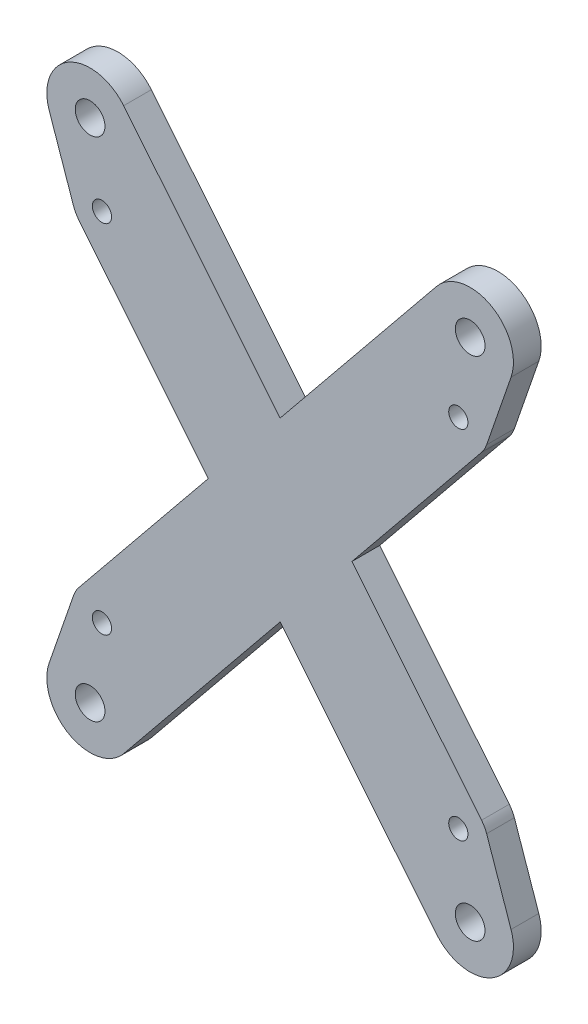
ISO-10303-21;
HEADER;
FILE_DESCRIPTION(('STEP AP214'),'2;1');
FILE_NAME('part.step','',(''),(''),'','','');
FILE_SCHEMA(('AUTOMOTIVE_DESIGN { 1 0 10303 214 1 1 1 1 }'));
ENDSEC;
DATA;
#1=APPLICATION_CONTEXT('core data for automotive mechanical design processes');
#2=APPLICATION_PROTOCOL_DEFINITION('international standard','automotive_design',2000,#1);
#3=PRODUCT_CONTEXT('',#1,'mechanical');
#4=PRODUCT('Part','Part','',(#3));
#5=PRODUCT_RELATED_PRODUCT_CATEGORY('part','',(#4));
#6=PRODUCT_DEFINITION_FORMATION('','',#4);
#7=PRODUCT_DEFINITION_CONTEXT('part definition',#1,'design');
#8=PRODUCT_DEFINITION('design','',#6,#7);
#9=PRODUCT_DEFINITION_SHAPE('','',#8);
#10=(LENGTH_UNIT() NAMED_UNIT(*) SI_UNIT(.MILLI.,.METRE.));
#11=(NAMED_UNIT(*) PLANE_ANGLE_UNIT() SI_UNIT($,.RADIAN.));
#12=(NAMED_UNIT(*) SI_UNIT($,.STERADIAN.) SOLID_ANGLE_UNIT());
#13=UNCERTAINTY_MEASURE_WITH_UNIT(LENGTH_MEASURE(1.E-05),#10,'distance_accuracy_value','');
#14=(GEOMETRIC_REPRESENTATION_CONTEXT(3) GLOBAL_UNCERTAINTY_ASSIGNED_CONTEXT((#13)) GLOBAL_UNIT_ASSIGNED_CONTEXT((#10,
#11,#12)) REPRESENTATION_CONTEXT('',''));
#15=CARTESIAN_POINT('',(0.,0.,0.));
#16=DIRECTION('',(0.,0.,1.));
#17=DIRECTION('',(1.,0.,0.));
#18=AXIS2_PLACEMENT_3D('',#15,#16,#17);
#19=CARTESIAN_POINT('',(-20.40001,20.40001,3.175));
#20=DIRECTION('',(0.,0.,1.));
#21=DIRECTION('',(1.,0.,0.));
#22=AXIS2_PLACEMENT_3D('',#19,#20,#21);
#23=PLANE('',#22);
#24=CARTESIAN_POINT('',(-20.40001,-20.40001,3.175));
#25=DIRECTION('',(0.,0.,1.));
#26=DIRECTION('',(1.,0.,0.));
#27=AXIS2_PLACEMENT_3D('',#24,#25,#26);
#28=CIRCLE('',#27,1.1);
#29=CARTESIAN_POINT('',(-19.30001,-20.40001,3.175));
#30=VERTEX_POINT('',#29);
#31=EDGE_CURVE('E411',#30,#30,#28,.T.);
#32=ORIENTED_EDGE('',*,*,#31,.F.);
#33=EDGE_LOOP('',(#32));
#34=FACE_BOUND('',#33,.T.);
#35=CARTESIAN_POINT('',(20.40001,20.40001,3.175));
#36=DIRECTION('',(0.,0.,1.));
#37=DIRECTION('',(1.,0.,0.));
#38=AXIS2_PLACEMENT_3D('',#35,#36,#37);
#39=CIRCLE('',#38,1.1);
#40=CARTESIAN_POINT('',(21.50001,20.40001,3.175));
#41=VERTEX_POINT('',#40);
#42=EDGE_CURVE('E423',#41,#41,#39,.T.);
#43=ORIENTED_EDGE('',*,*,#42,.F.);
#44=EDGE_LOOP('',(#43));
#45=FACE_BOUND('',#44,.T.);
#46=CARTESIAN_POINT('',(-21.7551,-28.9941,3.175));
#47=DIRECTION('',(0.,0.,1.));
#48=DIRECTION('',(1.,0.,0.));
#49=AXIS2_PLACEMENT_3D('',#46,#47,#48);
#50=CIRCLE('',#49,1.7018);
#51=CARTESIAN_POINT('',(-20.0533,-28.9941,3.175));
#52=VERTEX_POINT('',#51);
#53=EDGE_CURVE('E435',#52,#52,#50,.T.);
#54=ORIENTED_EDGE('',*,*,#53,.F.);
#55=EDGE_LOOP('',(#54));
#56=FACE_BOUND('',#55,.T.);
#57=CARTESIAN_POINT('',(21.7551,28.9941,3.175));
#58=DIRECTION('',(0.,0.,1.));
#59=DIRECTION('',(1.,0.,0.));
#60=AXIS2_PLACEMENT_3D('',#57,#58,#59);
#61=CIRCLE('',#60,1.7018);
#62=CARTESIAN_POINT('',(23.4569,28.9941,3.175));
#63=VERTEX_POINT('',#62);
#64=EDGE_CURVE('E206',#63,#63,#61,.T.);
#65=ORIENTED_EDGE('',*,*,#64,.F.);
#66=EDGE_LOOP('',(#65));
#67=FACE_BOUND('',#66,.T.);
#68=DIRECTION('',(-0.631137739312024,-0.775670776822298,0.));
#69=VECTOR('',#68,1.);
#70=CARTESIAN_POINT('',(-23.0597850937237,-18.2358386918991,3.175));
#71=LINE('',#70,#69);
#72=CARTESIAN_POINT('',(-8.22188433689183,0.,3.175));
#73=VERTEX_POINT('',#72);
#74=CARTESIAN_POINT('',(-23.0597850937237,-18.2358386918991,3.175));
#75=VERTEX_POINT('',#74);
#76=EDGE_CURVE('E241',#73,#75,#71,.T.);
#77=ORIENTED_EDGE('',*,*,#76,.T.);
#78=CARTESIAN_POINT('',(-20.40001,-20.40001,3.175));
#79=DIRECTION('',(0.,0.,1.));
#80=DIRECTION('',(1.,0.,0.));
#81=AXIS2_PLACEMENT_3D('',#78,#79,#80);
#82=CIRCLE('',#81,3.429);
#83=CARTESIAN_POINT('',(-23.6412405850369,-19.2808740410471,3.175));
#84=VERTEX_POINT('',#83);
#85=EDGE_CURVE('E129',#75,#84,#82,.T.);
#86=ORIENTED_EDGE('',*,*,#85,.T.);
#87=DIRECTION('',(-0.326373857962355,-0.945240765540065,0.));
#88=VECTOR('',#87,1.);
#89=CARTESIAN_POINT('',(-26.4368775117199,-27.3775702815125,3.175));
#90=LINE('',#89,#88);
#91=CARTESIAN_POINT('',(-26.4368775117199,-27.3775702815125,3.175));
#92=VERTEX_POINT('',#91);
#93=EDGE_CURVE('E292',#84,#92,#90,.T.);
#94=ORIENTED_EDGE('',*,*,#93,.T.);
#95=CARTESIAN_POINT('',(-21.7551,-28.9941,3.175));
#96=DIRECTION('',(0.,0.,1.));
#97=DIRECTION('',(1.,0.,0.));
#98=AXIS2_PLACEMENT_3D('',#95,#96,#97);
#99=CIRCLE('',#98,4.953);
#100=CARTESIAN_POINT('',(-17.9132026423992,-32.1201252228124,3.175));
#101=VERTEX_POINT('',#100);
#102=EDGE_CURVE('E311',#92,#101,#99,.T.);
#103=ORIENTED_EDGE('',*,*,#102,.T.);
#104=DIRECTION('',(0.631137739312024,0.775670776822299,0.));
#105=VECTOR('',#104,1.);
#106=CARTESIAN_POINT('',(-17.9132026423992,-32.1201252228124,3.175));
#107=LINE('',#106,#105);
#108=CARTESIAN_POINT('',(0.,-10.1047283553219,3.175));
#109=VERTEX_POINT('',#108);
#110=EDGE_CURVE('E308',#101,#109,#107,.T.);
#111=ORIENTED_EDGE('',*,*,#110,.T.);
#112=DIRECTION('',(0.631137739312024,-0.775670776822299,0.));
#113=VECTOR('',#112,1.);
#114=CARTESIAN_POINT('',(17.9132026423992,-32.1201252228124,3.175));
#115=LINE('',#114,#113);
#116=CARTESIAN_POINT('',(17.9132026423992,-32.1201252228124,3.175));
#117=VERTEX_POINT('',#116);
#118=EDGE_CURVE('E310',#109,#117,#115,.T.);
#119=ORIENTED_EDGE('',*,*,#118,.T.);
#120=CARTESIAN_POINT('',(21.7551,-28.9941,3.175));
#121=DIRECTION('',(0.,0.,1.));
#122=DIRECTION('',(1.,0.,0.));
#123=AXIS2_PLACEMENT_3D('',#120,#121,#122);
#124=CIRCLE('',#123,4.953);
#125=CARTESIAN_POINT('',(26.4368775117199,-27.3775702815125,3.175));
#126=VERTEX_POINT('',#125);
#127=EDGE_CURVE('E313',#117,#126,#124,.T.);
#128=ORIENTED_EDGE('',*,*,#127,.T.);
#129=DIRECTION('',(-0.326373857962355,0.945240765540065,0.));
#130=VECTOR('',#129,1.);
#131=CARTESIAN_POINT('',(26.4368775117199,-27.3775702815125,3.175));
#132=LINE('',#131,#130);
#133=CARTESIAN_POINT('',(23.6412405850369,-19.2808740410471,3.175));
#134=VERTEX_POINT('',#133);
#135=EDGE_CURVE('E319',#126,#134,#132,.T.);
#136=ORIENTED_EDGE('',*,*,#135,.T.);
#137=CARTESIAN_POINT('',(20.40001,-20.40001,3.175));
#138=DIRECTION('',(0.,0.,1.));
#139=DIRECTION('',(1.,0.,0.));
#140=AXIS2_PLACEMENT_3D('',#137,#138,#139);
#141=CIRCLE('',#140,3.42899999999999);
#142=CARTESIAN_POINT('',(23.0597850937237,-18.2358386918991,3.175));
#143=VERTEX_POINT('',#142);
#144=EDGE_CURVE('E321',#134,#143,#141,.T.);
#145=ORIENTED_EDGE('',*,*,#144,.T.);
#146=DIRECTION('',(-0.631137739312024,0.775670776822298,0.));
#147=VECTOR('',#146,1.);
#148=CARTESIAN_POINT('',(23.0597850937237,-18.2358386918991,3.175));
#149=LINE('',#148,#147);
#150=CARTESIAN_POINT('',(8.22188433689183,0.,3.175));
#151=VERTEX_POINT('',#150);
#152=EDGE_CURVE('E323',#143,#151,#149,.T.);
#153=ORIENTED_EDGE('',*,*,#152,.T.);
#154=DIRECTION('',(0.631137739312024,0.775670776822298,0.));
#155=VECTOR('',#154,1.);
#156=CARTESIAN_POINT('',(23.0597850937237,18.2358386918991,3.175));
#157=LINE('',#156,#155);
#158=CARTESIAN_POINT('',(23.0597850937237,18.2358386918991,3.175));
#159=VERTEX_POINT('',#158);
#160=EDGE_CURVE('E325',#151,#159,#157,.T.);
#161=ORIENTED_EDGE('',*,*,#160,.T.);
#162=CARTESIAN_POINT('',(20.40001,20.40001,3.175));
#163=DIRECTION('',(0.,0.,1.));
#164=DIRECTION('',(1.,0.,0.));
#165=AXIS2_PLACEMENT_3D('',#162,#163,#164);
#166=CIRCLE('',#165,3.42900000000001);
#167=CARTESIAN_POINT('',(23.6412405850369,19.2808740410471,3.175));
#168=VERTEX_POINT('',#167);
#169=EDGE_CURVE('E327',#159,#168,#166,.T.);
#170=ORIENTED_EDGE('',*,*,#169,.T.);
#171=DIRECTION('',(0.326373857962354,0.945240765540066,0.));
#172=VECTOR('',#171,1.);
#173=CARTESIAN_POINT('',(26.4368775117199,27.3775702815125,3.175));
#174=LINE('',#173,#172);
#175=CARTESIAN_POINT('',(26.4368775117199,27.3775702815125,3.175));
#176=VERTEX_POINT('',#175);
#177=EDGE_CURVE('E329',#168,#176,#174,.T.);
#178=ORIENTED_EDGE('',*,*,#177,.T.);
#179=CARTESIAN_POINT('',(21.7551,28.9941,3.175));
#180=DIRECTION('',(0.,0.,1.));
#181=DIRECTION('',(1.,0.,0.));
#182=AXIS2_PLACEMENT_3D('',#179,#180,#181);
#183=CIRCLE('',#182,4.953);
#184=CARTESIAN_POINT('',(17.9132026423992,32.1201252228124,3.175));
#185=VERTEX_POINT('',#184);
#186=EDGE_CURVE('E331',#176,#185,#183,.T.);
#187=ORIENTED_EDGE('',*,*,#186,.T.);
#188=DIRECTION('',(-0.631137739312024,-0.775670776822299,0.));
#189=VECTOR('',#188,1.);
#190=CARTESIAN_POINT('',(17.9132026423992,32.1201252228124,3.175));
#191=LINE('',#190,#189);
#192=CARTESIAN_POINT('',(0.,10.1047283553219,3.175));
#193=VERTEX_POINT('',#192);
#194=EDGE_CURVE('E333',#185,#193,#191,.T.);
#195=ORIENTED_EDGE('',*,*,#194,.T.);
#196=DIRECTION('',(-0.631137739312024,0.775670776822299,0.));
#197=VECTOR('',#196,1.);
#198=CARTESIAN_POINT('',(-17.9132026423992,32.1201252228124,3.175));
#199=LINE('',#198,#197);
#200=CARTESIAN_POINT('',(-17.9132026423992,32.1201252228124,3.175));
#201=VERTEX_POINT('',#200);
#202=EDGE_CURVE('E335',#193,#201,#199,.T.);
#203=ORIENTED_EDGE('',*,*,#202,.T.);
#204=CARTESIAN_POINT('',(-21.7551,28.9941,3.175));
#205=DIRECTION('',(0.,0.,1.));
#206=DIRECTION('',(1.,0.,0.));
#207=AXIS2_PLACEMENT_3D('',#204,#205,#206);
#208=CIRCLE('',#207,4.95299999999999);
#209=CARTESIAN_POINT('',(-26.4368775117199,27.3775702815125,3.175));
#210=VERTEX_POINT('',#209);
#211=EDGE_CURVE('E184',#201,#210,#208,.T.);
#212=ORIENTED_EDGE('',*,*,#211,.T.);
#213=DIRECTION('',(0.326373857962355,-0.945240765540065,0.));
#214=VECTOR('',#213,1.);
#215=CARTESIAN_POINT('',(-26.4368775117199,27.3775702815125,3.175));
#216=LINE('',#215,#214);
#217=CARTESIAN_POINT('',(-23.6412405850369,19.2808740410471,3.175));
#218=VERTEX_POINT('',#217);
#219=EDGE_CURVE('E178',#210,#218,#216,.T.);
#220=ORIENTED_EDGE('',*,*,#219,.T.);
#221=CARTESIAN_POINT('',(-20.40001,20.40001,3.175));
#222=DIRECTION('',(0.,0.,1.));
#223=DIRECTION('',(1.,0.,0.));
#224=AXIS2_PLACEMENT_3D('',#221,#222,#223);
#225=CIRCLE('',#224,3.42900000000001);
#226=CARTESIAN_POINT('',(-23.0597850937237,18.2358386918991,3.175));
#227=VERTEX_POINT('',#226);
#228=EDGE_CURVE('E182',#218,#227,#225,.T.);
#229=ORIENTED_EDGE('',*,*,#228,.T.);
#230=DIRECTION('',(0.631137739312024,-0.775670776822298,0.));
#231=VECTOR('',#230,1.);
#232=CARTESIAN_POINT('',(-23.0597850937237,18.2358386918991,3.175));
#233=LINE('',#232,#231);
#234=EDGE_CURVE('E50',#227,#73,#233,.T.);
#235=ORIENTED_EDGE('',*,*,#234,.T.);
#236=EDGE_LOOP('',(#77,#86,#94,#103,#111,#119,#128,#136,#145,#153,#161,#170,#178,#187,#195,#203,
#212,#220,#229,#235));
#237=FACE_BOUND('',#236,.T.);
#238=CARTESIAN_POINT('',(-21.7551,28.9941,3.175));
#239=DIRECTION('',(0.,0.,1.));
#240=DIRECTION('',(1.,0.,0.));
#241=AXIS2_PLACEMENT_3D('',#238,#239,#240);
#242=CIRCLE('',#241,1.7018);
#243=CARTESIAN_POINT('',(-20.0533,28.9941,3.175));
#244=VERTEX_POINT('',#243);
#245=EDGE_CURVE('E441',#244,#244,#242,.T.);
#246=ORIENTED_EDGE('',*,*,#245,.F.);
#247=EDGE_LOOP('',(#246));
#248=FACE_BOUND('',#247,.T.);
#249=CARTESIAN_POINT('',(21.7551,-28.9941,3.175));
#250=DIRECTION('',(0.,0.,1.));
#251=DIRECTION('',(1.,0.,0.));
#252=AXIS2_PLACEMENT_3D('',#249,#250,#251);
#253=CIRCLE('',#252,1.7018);
#254=CARTESIAN_POINT('',(23.4569,-28.9941,3.175));
#255=VERTEX_POINT('',#254);
#256=EDGE_CURVE('E429',#255,#255,#253,.T.);
#257=ORIENTED_EDGE('',*,*,#256,.F.);
#258=EDGE_LOOP('',(#257));
#259=FACE_BOUND('',#258,.T.);
#260=CARTESIAN_POINT('',(-20.40001,20.40001,3.175));
#261=DIRECTION('',(0.,0.,1.));
#262=DIRECTION('',(1.,0.,0.));
#263=AXIS2_PLACEMENT_3D('',#260,#261,#262);
#264=CIRCLE('',#263,1.1);
#265=CARTESIAN_POINT('',(-19.30001,20.40001,3.175));
#266=VERTEX_POINT('',#265);
#267=EDGE_CURVE('E417',#266,#266,#264,.T.);
#268=ORIENTED_EDGE('',*,*,#267,.F.);
#269=EDGE_LOOP('',(#268));
#270=FACE_BOUND('',#269,.T.);
#271=CARTESIAN_POINT('',(20.40001,-20.40001,3.175));
#272=DIRECTION('',(0.,0.,1.));
#273=DIRECTION('',(1.,0.,0.));
#274=AXIS2_PLACEMENT_3D('',#271,#272,#273);
#275=CIRCLE('',#274,1.1);
#276=CARTESIAN_POINT('',(21.50001,-20.40001,3.175));
#277=VERTEX_POINT('',#276);
#278=EDGE_CURVE('E402',#277,#277,#275,.T.);
#279=ORIENTED_EDGE('',*,*,#278,.F.);
#280=EDGE_LOOP('',(#279));
#281=FACE_BOUND('',#280,.T.);
#282=ADVANCED_FACE('F33',(#34,#45,#56,#67,#237,#248,#259,#270,#281),#23,.T.);
#283=CARTESIAN_POINT('',(-20.40001,20.40001,0.));
#284=DIRECTION('',(0.,0.,1.));
#285=DIRECTION('',(1.,0.,0.));
#286=AXIS2_PLACEMENT_3D('',#283,#284,#285);
#287=PLANE('',#286);
#288=DIRECTION('',(-0.631137739312024,-0.775670776822298,0.));
#289=VECTOR('',#288,1.);
#290=CARTESIAN_POINT('',(-23.0597850937237,-18.2358386918991,0.));
#291=LINE('',#290,#289);
#292=CARTESIAN_POINT('',(-8.22188433689183,0.,0.));
#293=VERTEX_POINT('',#292);
#294=CARTESIAN_POINT('',(-23.0597850937237,-18.2358386918991,0.));
#295=VERTEX_POINT('',#294);
#296=EDGE_CURVE('E202',#293,#295,#291,.T.);
#297=ORIENTED_EDGE('',*,*,#296,.F.);
#298=DIRECTION('',(0.631137739312024,-0.775670776822298,0.));
#299=VECTOR('',#298,1.);
#300=CARTESIAN_POINT('',(-23.0597850937237,18.2358386918991,0.));
#301=LINE('',#300,#299);
#302=CARTESIAN_POINT('',(-23.0597850937237,18.2358386918991,0.));
#303=VERTEX_POINT('',#302);
#304=EDGE_CURVE('E121',#303,#293,#301,.T.);
#305=ORIENTED_EDGE('',*,*,#304,.F.);
#306=CARTESIAN_POINT('',(-20.40001,20.40001,0.));
#307=DIRECTION('',(0.,0.,1.));
#308=DIRECTION('',(1.,0.,0.));
#309=AXIS2_PLACEMENT_3D('',#306,#307,#308);
#310=CIRCLE('',#309,3.42900000000001);
#311=CARTESIAN_POINT('',(-23.6412405850369,19.2808740410471,0.));
#312=VERTEX_POINT('',#311);
#313=EDGE_CURVE('E115',#312,#303,#310,.T.);
#314=ORIENTED_EDGE('',*,*,#313,.F.);
#315=DIRECTION('',(0.326373857962355,-0.945240765540065,0.));
#316=VECTOR('',#315,1.);
#317=CARTESIAN_POINT('',(-26.4368775117199,27.3775702815125,0.));
#318=LINE('',#317,#316);
#319=CARTESIAN_POINT('',(-26.4368775117199,27.3775702815125,0.));
#320=VERTEX_POINT('',#319);
#321=EDGE_CURVE('E192',#320,#312,#318,.T.);
#322=ORIENTED_EDGE('',*,*,#321,.F.);
#323=CARTESIAN_POINT('',(-21.7551,28.9941,0.));
#324=DIRECTION('',(0.,0.,1.));
#325=DIRECTION('',(1.,0.,0.));
#326=AXIS2_PLACEMENT_3D('',#323,#324,#325);
#327=CIRCLE('',#326,4.95299999999999);
#328=CARTESIAN_POINT('',(-17.9132026423992,32.1201252228124,0.));
#329=VERTEX_POINT('',#328);
#330=EDGE_CURVE('E236',#329,#320,#327,.T.);
#331=ORIENTED_EDGE('',*,*,#330,.F.);
#332=DIRECTION('',(-0.631137739312024,0.775670776822299,0.));
#333=VECTOR('',#332,1.);
#334=CARTESIAN_POINT('',(-17.9132026423992,32.1201252228124,0.));
#335=LINE('',#334,#333);
#336=CARTESIAN_POINT('',(0.,10.1047283553219,0.));
#337=VERTEX_POINT('',#336);
#338=EDGE_CURVE('E234',#337,#329,#335,.T.);
#339=ORIENTED_EDGE('',*,*,#338,.F.);
#340=DIRECTION('',(-0.631137739312024,-0.775670776822299,0.));
#341=VECTOR('',#340,1.);
#342=CARTESIAN_POINT('',(17.9132026423992,32.1201252228124,0.));
#343=LINE('',#342,#341);
#344=CARTESIAN_POINT('',(17.9132026423992,32.1201252228124,0.));
#345=VERTEX_POINT('',#344);
#346=EDGE_CURVE('E232',#345,#337,#343,.T.);
#347=ORIENTED_EDGE('',*,*,#346,.F.);
#348=CARTESIAN_POINT('',(21.7551,28.9941,0.));
#349=DIRECTION('',(0.,0.,1.));
#350=DIRECTION('',(1.,0.,0.));
#351=AXIS2_PLACEMENT_3D('',#348,#349,#350);
#352=CIRCLE('',#351,4.953);
#353=CARTESIAN_POINT('',(26.4368775117199,27.3775702815125,0.));
#354=VERTEX_POINT('',#353);
#355=EDGE_CURVE('E230',#354,#345,#352,.T.);
#356=ORIENTED_EDGE('',*,*,#355,.F.);
#357=DIRECTION('',(0.326373857962354,0.945240765540066,0.));
#358=VECTOR('',#357,1.);
#359=CARTESIAN_POINT('',(26.4368775117199,27.3775702815125,0.));
#360=LINE('',#359,#358);
#361=CARTESIAN_POINT('',(23.6412405850369,19.2808740410471,0.));
#362=VERTEX_POINT('',#361);
#363=EDGE_CURVE('E228',#362,#354,#360,.T.);
#364=ORIENTED_EDGE('',*,*,#363,.F.);
#365=CARTESIAN_POINT('',(20.40001,20.40001,0.));
#366=DIRECTION('',(0.,0.,1.));
#367=DIRECTION('',(1.,0.,0.));
#368=AXIS2_PLACEMENT_3D('',#365,#366,#367);
#369=CIRCLE('',#368,3.42900000000001);
#370=CARTESIAN_POINT('',(23.0597850937237,18.2358386918991,0.));
#371=VERTEX_POINT('',#370);
#372=EDGE_CURVE('E226',#371,#362,#369,.T.);
#373=ORIENTED_EDGE('',*,*,#372,.F.);
#374=DIRECTION('',(0.631137739312024,0.775670776822298,0.));
#375=VECTOR('',#374,1.);
#376=CARTESIAN_POINT('',(23.0597850937237,18.2358386918991,0.));
#377=LINE('',#376,#375);
#378=CARTESIAN_POINT('',(8.22188433689183,0.,0.));
#379=VERTEX_POINT('',#378);
#380=EDGE_CURVE('E224',#379,#371,#377,.T.);
#381=ORIENTED_EDGE('',*,*,#380,.F.);
#382=DIRECTION('',(-0.631137739312024,0.775670776822298,0.));
#383=VECTOR('',#382,1.);
#384=CARTESIAN_POINT('',(23.0597850937237,-18.2358386918991,0.));
#385=LINE('',#384,#383);
#386=CARTESIAN_POINT('',(23.0597850937237,-18.2358386918991,0.));
#387=VERTEX_POINT('',#386);
#388=EDGE_CURVE('E222',#387,#379,#385,.T.);
#389=ORIENTED_EDGE('',*,*,#388,.F.);
#390=CARTESIAN_POINT('',(20.40001,-20.40001,0.));
#391=DIRECTION('',(0.,0.,1.));
#392=DIRECTION('',(1.,0.,0.));
#393=AXIS2_PLACEMENT_3D('',#390,#391,#392);
#394=CIRCLE('',#393,3.42899999999999);
#395=CARTESIAN_POINT('',(23.6412405850369,-19.2808740410471,0.));
#396=VERTEX_POINT('',#395);
#397=EDGE_CURVE('E220',#396,#387,#394,.T.);
#398=ORIENTED_EDGE('',*,*,#397,.F.);
#399=DIRECTION('',(-0.326373857962355,0.945240765540065,0.));
#400=VECTOR('',#399,1.);
#401=CARTESIAN_POINT('',(26.4368775117199,-27.3775702815125,0.));
#402=LINE('',#401,#400);
#403=CARTESIAN_POINT('',(26.4368775117199,-27.3775702815125,0.));
#404=VERTEX_POINT('',#403);
#405=EDGE_CURVE('E218',#404,#396,#402,.T.);
#406=ORIENTED_EDGE('',*,*,#405,.F.);
#407=CARTESIAN_POINT('',(21.7551,-28.9941,0.));
#408=DIRECTION('',(0.,0.,1.));
#409=DIRECTION('',(1.,0.,0.));
#410=AXIS2_PLACEMENT_3D('',#407,#408,#409);
#411=CIRCLE('',#410,4.953);
#412=CARTESIAN_POINT('',(17.9132026423992,-32.1201252228124,0.));
#413=VERTEX_POINT('',#412);
#414=EDGE_CURVE('E216',#413,#404,#411,.T.);
#415=ORIENTED_EDGE('',*,*,#414,.F.);
#416=DIRECTION('',(0.631137739312024,-0.775670776822299,0.));
#417=VECTOR('',#416,1.);
#418=CARTESIAN_POINT('',(17.9132026423992,-32.1201252228124,0.));
#419=LINE('',#418,#417);
#420=CARTESIAN_POINT('',(0.,-10.1047283553219,0.));
#421=VERTEX_POINT('',#420);
#422=EDGE_CURVE('E214',#421,#413,#419,.T.);
#423=ORIENTED_EDGE('',*,*,#422,.F.);
#424=DIRECTION('',(0.631137739312024,0.775670776822299,0.));
#425=VECTOR('',#424,1.);
#426=CARTESIAN_POINT('',(-17.9132026423992,-32.1201252228124,0.));
#427=LINE('',#426,#425);
#428=CARTESIAN_POINT('',(-17.9132026423992,-32.1201252228124,0.));
#429=VERTEX_POINT('',#428);
#430=EDGE_CURVE('E212',#429,#421,#427,.T.);
#431=ORIENTED_EDGE('',*,*,#430,.F.);
#432=CARTESIAN_POINT('',(-21.7551,-28.9941,0.));
#433=DIRECTION('',(0.,0.,1.));
#434=DIRECTION('',(1.,0.,0.));
#435=AXIS2_PLACEMENT_3D('',#432,#433,#434);
#436=CIRCLE('',#435,4.953);
#437=CARTESIAN_POINT('',(-26.4368775117199,-27.3775702815125,0.));
#438=VERTEX_POINT('',#437);
#439=EDGE_CURVE('E210',#438,#429,#436,.T.);
#440=ORIENTED_EDGE('',*,*,#439,.F.);
#441=DIRECTION('',(-0.326373857962355,-0.945240765540065,0.));
#442=VECTOR('',#441,1.);
#443=CARTESIAN_POINT('',(-26.4368775117199,-27.3775702815125,0.));
#444=LINE('',#443,#442);
#445=CARTESIAN_POINT('',(-23.6412405850369,-19.2808740410471,0.));
#446=VERTEX_POINT('',#445);
#447=EDGE_CURVE('E208',#446,#438,#444,.T.);
#448=ORIENTED_EDGE('',*,*,#447,.F.);
#449=CARTESIAN_POINT('',(-20.40001,-20.40001,0.));
#450=DIRECTION('',(0.,0.,1.));
#451=DIRECTION('',(1.,0.,0.));
#452=AXIS2_PLACEMENT_3D('',#449,#450,#451);
#453=CIRCLE('',#452,3.429);
#454=EDGE_CURVE('E205',#295,#446,#453,.T.);
#455=ORIENTED_EDGE('',*,*,#454,.F.);
#456=EDGE_LOOP('',(#297,#305,#314,#322,#331,#339,#347,#356,#364,#373,#381,#389,#398,#406,#415,
#423,#431,#440,#448,#455));
#457=FACE_BOUND('',#456,.T.);
#458=CARTESIAN_POINT('',(21.7551,28.9941,0.));
#459=DIRECTION('',(0.,0.,1.));
#460=DIRECTION('',(1.,0.,0.));
#461=AXIS2_PLACEMENT_3D('',#458,#459,#460);
#462=CIRCLE('',#461,1.7018);
#463=CARTESIAN_POINT('',(23.4569,28.9941,0.));
#464=VERTEX_POINT('',#463);
#465=EDGE_CURVE('E444',#464,#464,#462,.T.);
#466=ORIENTED_EDGE('',*,*,#465,.T.);
#467=EDGE_LOOP('',(#466));
#468=FACE_BOUND('',#467,.T.);
#469=CARTESIAN_POINT('',(-21.7551,28.9941,0.));
#470=DIRECTION('',(0.,0.,1.));
#471=DIRECTION('',(1.,0.,0.));
#472=AXIS2_PLACEMENT_3D('',#469,#470,#471);
#473=CIRCLE('',#472,1.7018);
#474=CARTESIAN_POINT('',(-20.0533,28.9941,0.));
#475=VERTEX_POINT('',#474);
#476=EDGE_CURVE('E438',#475,#475,#473,.T.);
#477=ORIENTED_EDGE('',*,*,#476,.T.);
#478=EDGE_LOOP('',(#477));
#479=FACE_BOUND('',#478,.T.);
#480=CARTESIAN_POINT('',(-21.7551,-28.9941,0.));
#481=DIRECTION('',(0.,0.,1.));
#482=DIRECTION('',(1.,0.,0.));
#483=AXIS2_PLACEMENT_3D('',#480,#481,#482);
#484=CIRCLE('',#483,1.7018);
#485=CARTESIAN_POINT('',(-20.0533,-28.9941,0.));
#486=VERTEX_POINT('',#485);
#487=EDGE_CURVE('E432',#486,#486,#484,.T.);
#488=ORIENTED_EDGE('',*,*,#487,.T.);
#489=EDGE_LOOP('',(#488));
#490=FACE_BOUND('',#489,.T.);
#491=CARTESIAN_POINT('',(21.7551,-28.9941,0.));
#492=DIRECTION('',(0.,0.,1.));
#493=DIRECTION('',(1.,0.,0.));
#494=AXIS2_PLACEMENT_3D('',#491,#492,#493);
#495=CIRCLE('',#494,1.7018);
#496=CARTESIAN_POINT('',(23.4569,-28.9941,0.));
#497=VERTEX_POINT('',#496);
#498=EDGE_CURVE('E426',#497,#497,#495,.T.);
#499=ORIENTED_EDGE('',*,*,#498,.T.);
#500=EDGE_LOOP('',(#499));
#501=FACE_BOUND('',#500,.T.);
#502=CARTESIAN_POINT('',(20.40001,20.40001,0.));
#503=DIRECTION('',(0.,0.,1.));
#504=DIRECTION('',(1.,0.,0.));
#505=AXIS2_PLACEMENT_3D('',#502,#503,#504);
#506=CIRCLE('',#505,1.1);
#507=CARTESIAN_POINT('',(21.50001,20.40001,0.));
#508=VERTEX_POINT('',#507);
#509=EDGE_CURVE('E420',#508,#508,#506,.T.);
#510=ORIENTED_EDGE('',*,*,#509,.T.);
#511=EDGE_LOOP('',(#510));
#512=FACE_BOUND('',#511,.T.);
#513=CARTESIAN_POINT('',(-20.40001,20.40001,0.));
#514=DIRECTION('',(0.,0.,1.));
#515=DIRECTION('',(1.,0.,0.));
#516=AXIS2_PLACEMENT_3D('',#513,#514,#515);
#517=CIRCLE('',#516,1.1);
#518=CARTESIAN_POINT('',(-19.30001,20.40001,0.));
#519=VERTEX_POINT('',#518);
#520=EDGE_CURVE('E414',#519,#519,#517,.T.);
#521=ORIENTED_EDGE('',*,*,#520,.T.);
#522=EDGE_LOOP('',(#521));
#523=FACE_BOUND('',#522,.T.);
#524=CARTESIAN_POINT('',(-20.40001,-20.40001,0.));
#525=DIRECTION('',(0.,0.,1.));
#526=DIRECTION('',(1.,0.,0.));
#527=AXIS2_PLACEMENT_3D('',#524,#525,#526);
#528=CIRCLE('',#527,1.1);
#529=CARTESIAN_POINT('',(-19.30001,-20.40001,0.));
#530=VERTEX_POINT('',#529);
#531=EDGE_CURVE('E408',#530,#530,#528,.T.);
#532=ORIENTED_EDGE('',*,*,#531,.T.);
#533=EDGE_LOOP('',(#532));
#534=FACE_BOUND('',#533,.T.);
#535=CARTESIAN_POINT('',(20.40001,-20.40001,0.));
#536=DIRECTION('',(0.,0.,1.));
#537=DIRECTION('',(1.,0.,0.));
#538=AXIS2_PLACEMENT_3D('',#535,#536,#537);
#539=CIRCLE('',#538,1.1);
#540=CARTESIAN_POINT('',(21.50001,-20.40001,0.));
#541=VERTEX_POINT('',#540);
#542=EDGE_CURVE('E405',#541,#541,#539,.T.);
#543=ORIENTED_EDGE('',*,*,#542,.T.);
#544=EDGE_LOOP('',(#543));
#545=FACE_BOUND('',#544,.T.);
#546=ADVANCED_FACE('F296',(#457,#468,#479,#490,#501,#512,#523,#534,#545),#287,.F.);
#547=CARTESIAN_POINT('',(-23.0597850937237,-18.2358386918991,3.175));
#548=DIRECTION('',(0.775670776822298,-0.631137739312024,0.));
#549=DIRECTION('',(0.631137739312024,0.775670776822298,0.));
#550=AXIS2_PLACEMENT_3D('',#547,#548,#549);
#551=PLANE('',#550);
#552=ORIENTED_EDGE('',*,*,#296,.T.);
#553=DIRECTION('',(0.,0.,-1.));
#554=VECTOR('',#553,1.);
#555=CARTESIAN_POINT('',(-23.0597850937237,-18.2358386918991,3.175));
#556=LINE('',#555,#554);
#557=EDGE_CURVE('E11',#75,#295,#556,.T.);
#558=ORIENTED_EDGE('',*,*,#557,.F.);
#559=ORIENTED_EDGE('',*,*,#76,.F.);
#560=DIRECTION('',(0.,0.,-1.));
#561=VECTOR('',#560,1.);
#562=CARTESIAN_POINT('',(-8.22188433689183,0.,3.175));
#563=LINE('',#562,#561);
#564=EDGE_CURVE('E198',#73,#293,#563,.T.);
#565=ORIENTED_EDGE('',*,*,#564,.T.);
#566=EDGE_LOOP('',(#552,#558,#559,#565));
#567=FACE_BOUND('',#566,.T.);
#568=ADVANCED_FACE('F35',(#567),#551,.F.);
#569=CARTESIAN_POINT('',(-20.40001,-20.40001,3.175));
#570=DIRECTION('',(0.,0.,-1.));
#571=DIRECTION('',(-1.,0.,0.));
#572=AXIS2_PLACEMENT_3D('',#569,#570,#571);
#573=CYLINDRICAL_SURFACE('',#572,3.429);
#574=ORIENTED_EDGE('',*,*,#454,.T.);
#575=DIRECTION('',(0.,0.,-1.));
#576=VECTOR('',#575,1.);
#577=CARTESIAN_POINT('',(-23.6412405850369,-19.2808740410471,3.175));
#578=LINE('',#577,#576);
#579=EDGE_CURVE('E42',#84,#446,#578,.T.);
#580=ORIENTED_EDGE('',*,*,#579,.F.);
#581=ORIENTED_EDGE('',*,*,#85,.F.);
#582=ORIENTED_EDGE('',*,*,#557,.T.);
#583=EDGE_LOOP('',(#574,#580,#581,#582));
#584=FACE_BOUND('',#583,.T.);
#585=ADVANCED_FACE('F670',(#584),#573,.T.);
#586=CARTESIAN_POINT('',(-26.4368775117199,-27.3775702815125,3.175));
#587=DIRECTION('',(0.945240765540065,-0.326373857962355,0.));
#588=DIRECTION('',(0.326373857962355,0.945240765540066,0.));
#589=AXIS2_PLACEMENT_3D('',#586,#587,#588);
#590=PLANE('',#589);
#591=ORIENTED_EDGE('',*,*,#447,.T.);
#592=DIRECTION('',(0.,0.,-1.));
#593=VECTOR('',#592,1.);
#594=CARTESIAN_POINT('',(-26.4368775117199,-27.3775702815125,3.175));
#595=LINE('',#594,#593);
#596=EDGE_CURVE('E284',#92,#438,#595,.T.);
#597=ORIENTED_EDGE('',*,*,#596,.F.);
#598=ORIENTED_EDGE('',*,*,#93,.F.);
#599=ORIENTED_EDGE('',*,*,#579,.T.);
#600=EDGE_LOOP('',(#591,#597,#598,#599));
#601=FACE_BOUND('',#600,.T.);
#602=ADVANCED_FACE('F290',(#601),#590,.F.);
#603=CARTESIAN_POINT('',(-21.7551,-28.9941,3.175));
#604=DIRECTION('',(0.,0.,-1.));
#605=DIRECTION('',(-1.,0.,0.));
#606=AXIS2_PLACEMENT_3D('',#603,#604,#605);
#607=CYLINDRICAL_SURFACE('',#606,4.953);
#608=ORIENTED_EDGE('',*,*,#439,.T.);
#609=DIRECTION('',(0.,0.,-1.));
#610=VECTOR('',#609,1.);
#611=CARTESIAN_POINT('',(-17.9132026423992,-32.1201252228124,3.175));
#612=LINE('',#611,#610);
#613=EDGE_CURVE('E281',#101,#429,#612,.T.);
#614=ORIENTED_EDGE('',*,*,#613,.F.);
#615=ORIENTED_EDGE('',*,*,#102,.F.);
#616=ORIENTED_EDGE('',*,*,#596,.T.);
#617=EDGE_LOOP('',(#608,#614,#615,#616));
#618=FACE_BOUND('',#617,.T.);
#619=ADVANCED_FACE('F302',(#618),#607,.T.);
#620=CARTESIAN_POINT('',(-17.9132026423992,-32.1201252228124,3.175));
#621=DIRECTION('',(-0.775670776822299,0.631137739312023,0.));
#622=DIRECTION('',(-0.631137739312023,-0.775670776822299,0.));
#623=AXIS2_PLACEMENT_3D('',#620,#621,#622);
#624=PLANE('',#623);
#625=ORIENTED_EDGE('',*,*,#430,.T.);
#626=DIRECTION('',(0.,0.,-1.));
#627=VECTOR('',#626,1.);
#628=CARTESIAN_POINT('',(0.,-10.1047283553219,3.175));
#629=LINE('',#628,#627);
#630=EDGE_CURVE('E278',#109,#421,#629,.T.);
#631=ORIENTED_EDGE('',*,*,#630,.F.);
#632=ORIENTED_EDGE('',*,*,#110,.F.);
#633=ORIENTED_EDGE('',*,*,#613,.T.);
#634=EDGE_LOOP('',(#625,#631,#632,#633));
#635=FACE_BOUND('',#634,.T.);
#636=ADVANCED_FACE('F306',(#635),#624,.F.);
#637=CARTESIAN_POINT('',(17.9132026423992,-32.1201252228124,3.175));
#638=DIRECTION('',(0.775670776822299,0.631137739312023,0.));
#639=DIRECTION('',(-0.631137739312023,0.775670776822299,0.));
#640=AXIS2_PLACEMENT_3D('',#637,#638,#639);
#641=PLANE('',#640);
#642=ORIENTED_EDGE('',*,*,#422,.T.);
#643=DIRECTION('',(0.,0.,-1.));
#644=VECTOR('',#643,1.);
#645=CARTESIAN_POINT('',(17.9132026423992,-32.1201252228124,3.175));
#646=LINE('',#645,#644);
#647=EDGE_CURVE('E275',#117,#413,#646,.T.);
#648=ORIENTED_EDGE('',*,*,#647,.F.);
#649=ORIENTED_EDGE('',*,*,#118,.F.);
#650=ORIENTED_EDGE('',*,*,#630,.T.);
#651=EDGE_LOOP('',(#642,#648,#649,#650));
#652=FACE_BOUND('',#651,.T.);
#653=ADVANCED_FACE('F635',(#652),#641,.F.);
#654=CARTESIAN_POINT('',(21.7551,-28.9941,3.175));
#655=DIRECTION('',(0.,0.,-1.));
#656=DIRECTION('',(-1.,0.,0.));
#657=AXIS2_PLACEMENT_3D('',#654,#655,#656);
#658=CYLINDRICAL_SURFACE('',#657,4.953);
#659=ORIENTED_EDGE('',*,*,#414,.T.);
#660=DIRECTION('',(0.,0.,-1.));
#661=VECTOR('',#660,1.);
#662=CARTESIAN_POINT('',(26.4368775117199,-27.3775702815125,3.175));
#663=LINE('',#662,#661);
#664=EDGE_CURVE('E272',#126,#404,#663,.T.);
#665=ORIENTED_EDGE('',*,*,#664,.F.);
#666=ORIENTED_EDGE('',*,*,#127,.F.);
#667=ORIENTED_EDGE('',*,*,#647,.T.);
#668=EDGE_LOOP('',(#659,#665,#666,#667));
#669=FACE_BOUND('',#668,.T.);
#670=ADVANCED_FACE('F625',(#669),#658,.T.);
#671=CARTESIAN_POINT('',(26.4368775117199,-27.3775702815125,3.175));
#672=DIRECTION('',(-0.945240765540065,-0.326373857962355,0.));
#673=DIRECTION('',(0.326373857962355,-0.945240765540066,0.));
#674=AXIS2_PLACEMENT_3D('',#671,#672,#673);
#675=PLANE('',#674);
#676=ORIENTED_EDGE('',*,*,#405,.T.);
#677=DIRECTION('',(0.,0.,-1.));
#678=VECTOR('',#677,1.);
#679=CARTESIAN_POINT('',(23.6412405850369,-19.2808740410471,3.175));
#680=LINE('',#679,#678);
#681=EDGE_CURVE('E269',#134,#396,#680,.T.);
#682=ORIENTED_EDGE('',*,*,#681,.F.);
#683=ORIENTED_EDGE('',*,*,#135,.F.);
#684=ORIENTED_EDGE('',*,*,#664,.T.);
#685=EDGE_LOOP('',(#676,#682,#683,#684));
#686=FACE_BOUND('',#685,.T.);
#687=ADVANCED_FACE('F615',(#686),#675,.F.);
#688=CARTESIAN_POINT('',(20.40001,-20.40001,3.175));
#689=DIRECTION('',(0.,0.,-1.));
#690=DIRECTION('',(-1.,0.,0.));
#691=AXIS2_PLACEMENT_3D('',#688,#689,#690);
#692=CYLINDRICAL_SURFACE('',#691,3.42899999999999);
#693=ORIENTED_EDGE('',*,*,#397,.T.);
#694=DIRECTION('',(0.,0.,-1.));
#695=VECTOR('',#694,1.);
#696=CARTESIAN_POINT('',(23.0597850937237,-18.2358386918991,3.175));
#697=LINE('',#696,#695);
#698=EDGE_CURVE('E266',#143,#387,#697,.T.);
#699=ORIENTED_EDGE('',*,*,#698,.F.);
#700=ORIENTED_EDGE('',*,*,#144,.F.);
#701=ORIENTED_EDGE('',*,*,#681,.T.);
#702=EDGE_LOOP('',(#693,#699,#700,#701));
#703=FACE_BOUND('',#702,.T.);
#704=ADVANCED_FACE('F605',(#703),#692,.T.);
#705=CARTESIAN_POINT('',(23.0597850937237,-18.2358386918991,3.175));
#706=DIRECTION('',(-0.775670776822298,-0.631137739312024,0.));
#707=DIRECTION('',(0.631137739312024,-0.775670776822298,0.));
#708=AXIS2_PLACEMENT_3D('',#705,#706,#707);
#709=PLANE('',#708);
#710=ORIENTED_EDGE('',*,*,#388,.T.);
#711=DIRECTION('',(0.,0.,-1.));
#712=VECTOR('',#711,1.);
#713=CARTESIAN_POINT('',(8.22188433689183,0.,3.175));
#714=LINE('',#713,#712);
#715=EDGE_CURVE('E263',#151,#379,#714,.T.);
#716=ORIENTED_EDGE('',*,*,#715,.F.);
#717=ORIENTED_EDGE('',*,*,#152,.F.);
#718=ORIENTED_EDGE('',*,*,#698,.T.);
#719=EDGE_LOOP('',(#710,#716,#717,#718));
#720=FACE_BOUND('',#719,.T.);
#721=ADVANCED_FACE('F595',(#720),#709,.F.);
#722=CARTESIAN_POINT('',(23.0597850937237,18.2358386918991,3.175));
#723=DIRECTION('',(-0.775670776822298,0.631137739312024,0.));
#724=DIRECTION('',(-0.631137739312024,-0.775670776822298,0.));
#725=AXIS2_PLACEMENT_3D('',#722,#723,#724);
#726=PLANE('',#725);
#727=ORIENTED_EDGE('',*,*,#380,.T.);
#728=DIRECTION('',(0.,0.,-1.));
#729=VECTOR('',#728,1.);
#730=CARTESIAN_POINT('',(23.0597850937237,18.2358386918991,3.175));
#731=LINE('',#730,#729);
#732=EDGE_CURVE('E260',#159,#371,#731,.T.);
#733=ORIENTED_EDGE('',*,*,#732,.F.);
#734=ORIENTED_EDGE('',*,*,#160,.F.);
#735=ORIENTED_EDGE('',*,*,#715,.T.);
#736=EDGE_LOOP('',(#727,#733,#734,#735));
#737=FACE_BOUND('',#736,.T.);
#738=ADVANCED_FACE('F585',(#737),#726,.F.);
#739=CARTESIAN_POINT('',(20.40001,20.40001,3.175));
#740=DIRECTION('',(0.,0.,-1.));
#741=DIRECTION('',(-1.,0.,0.));
#742=AXIS2_PLACEMENT_3D('',#739,#740,#741);
#743=CYLINDRICAL_SURFACE('',#742,3.42900000000001);
#744=ORIENTED_EDGE('',*,*,#372,.T.);
#745=DIRECTION('',(0.,0.,-1.));
#746=VECTOR('',#745,1.);
#747=CARTESIAN_POINT('',(23.6412405850369,19.2808740410471,3.175));
#748=LINE('',#747,#746);
#749=EDGE_CURVE('E257',#168,#362,#748,.T.);
#750=ORIENTED_EDGE('',*,*,#749,.F.);
#751=ORIENTED_EDGE('',*,*,#169,.F.);
#752=ORIENTED_EDGE('',*,*,#732,.T.);
#753=EDGE_LOOP('',(#744,#750,#751,#752));
#754=FACE_BOUND('',#753,.T.);
#755=ADVANCED_FACE('F575',(#754),#743,.T.);
#756=CARTESIAN_POINT('',(26.4368775117199,27.3775702815125,3.175));
#757=DIRECTION('',(-0.945240765540066,0.326373857962354,0.));
#758=DIRECTION('',(-0.326373857962354,-0.945240765540066,0.));
#759=AXIS2_PLACEMENT_3D('',#756,#757,#758);
#760=PLANE('',#759);
#761=ORIENTED_EDGE('',*,*,#363,.T.);
#762=DIRECTION('',(0.,0.,-1.));
#763=VECTOR('',#762,1.);
#764=CARTESIAN_POINT('',(26.4368775117199,27.3775702815125,3.175));
#765=LINE('',#764,#763);
#766=EDGE_CURVE('E254',#176,#354,#765,.T.);
#767=ORIENTED_EDGE('',*,*,#766,.F.);
#768=ORIENTED_EDGE('',*,*,#177,.F.);
#769=ORIENTED_EDGE('',*,*,#749,.T.);
#770=EDGE_LOOP('',(#761,#767,#768,#769));
#771=FACE_BOUND('',#770,.T.);
#772=ADVANCED_FACE('F565',(#771),#760,.F.);
#773=CARTESIAN_POINT('',(21.7551,28.9941,3.175));
#774=DIRECTION('',(0.,0.,-1.));
#775=DIRECTION('',(-1.,0.,0.));
#776=AXIS2_PLACEMENT_3D('',#773,#774,#775);
#777=CYLINDRICAL_SURFACE('',#776,4.953);
#778=ORIENTED_EDGE('',*,*,#355,.T.);
#779=DIRECTION('',(0.,0.,-1.));
#780=VECTOR('',#779,1.);
#781=CARTESIAN_POINT('',(17.9132026423992,32.1201252228124,3.175));
#782=LINE('',#781,#780);
#783=EDGE_CURVE('E251',#185,#345,#782,.T.);
#784=ORIENTED_EDGE('',*,*,#783,.F.);
#785=ORIENTED_EDGE('',*,*,#186,.F.);
#786=ORIENTED_EDGE('',*,*,#766,.T.);
#787=EDGE_LOOP('',(#778,#784,#785,#786));
#788=FACE_BOUND('',#787,.T.);
#789=ADVANCED_FACE('F555',(#788),#777,.T.);
#790=CARTESIAN_POINT('',(17.9132026423992,32.1201252228124,3.175));
#791=DIRECTION('',(0.775670776822299,-0.631137739312023,0.));
#792=DIRECTION('',(0.631137739312023,0.775670776822299,0.));
#793=AXIS2_PLACEMENT_3D('',#790,#791,#792);
#794=PLANE('',#793);
#795=ORIENTED_EDGE('',*,*,#346,.T.);
#796=DIRECTION('',(0.,0.,-1.));
#797=VECTOR('',#796,1.);
#798=CARTESIAN_POINT('',(0.,10.1047283553219,3.175));
#799=LINE('',#798,#797);
#800=EDGE_CURVE('E248',#193,#337,#799,.T.);
#801=ORIENTED_EDGE('',*,*,#800,.F.);
#802=ORIENTED_EDGE('',*,*,#194,.F.);
#803=ORIENTED_EDGE('',*,*,#783,.T.);
#804=EDGE_LOOP('',(#795,#801,#802,#803));
#805=FACE_BOUND('',#804,.T.);
#806=ADVANCED_FACE('F546',(#805),#794,.F.);
#807=CARTESIAN_POINT('',(-17.9132026423992,32.1201252228124,3.175));
#808=DIRECTION('',(-0.775670776822299,-0.631137739312023,0.));
#809=DIRECTION('',(0.631137739312023,-0.775670776822299,0.));
#810=AXIS2_PLACEMENT_3D('',#807,#808,#809);
#811=PLANE('',#810);
#812=ORIENTED_EDGE('',*,*,#338,.T.);
#813=DIRECTION('',(0.,0.,-1.));
#814=VECTOR('',#813,1.);
#815=CARTESIAN_POINT('',(-17.9132026423992,32.1201252228124,3.175));
#816=LINE('',#815,#814);
#817=EDGE_CURVE('E245',#201,#329,#816,.T.);
#818=ORIENTED_EDGE('',*,*,#817,.F.);
#819=ORIENTED_EDGE('',*,*,#202,.F.);
#820=ORIENTED_EDGE('',*,*,#800,.T.);
#821=EDGE_LOOP('',(#812,#818,#819,#820));
#822=FACE_BOUND('',#821,.T.);
#823=ADVANCED_FACE('F341',(#822),#811,.F.);
#824=CARTESIAN_POINT('',(-21.7551,28.9941,3.175));
#825=DIRECTION('',(0.,0.,-1.));
#826=DIRECTION('',(-1.,0.,0.));
#827=AXIS2_PLACEMENT_3D('',#824,#825,#826);
#828=CYLINDRICAL_SURFACE('',#827,4.95299999999999);
#829=ORIENTED_EDGE('',*,*,#330,.T.);
#830=DIRECTION('',(0.,0.,-1.));
#831=VECTOR('',#830,1.);
#832=CARTESIAN_POINT('',(-26.4368775117199,27.3775702815125,3.175));
#833=LINE('',#832,#831);
#834=EDGE_CURVE('E193',#210,#320,#833,.T.);
#835=ORIENTED_EDGE('',*,*,#834,.F.);
#836=ORIENTED_EDGE('',*,*,#211,.F.);
#837=ORIENTED_EDGE('',*,*,#817,.T.);
#838=EDGE_LOOP('',(#829,#835,#836,#837));
#839=FACE_BOUND('',#838,.T.);
#840=ADVANCED_FACE('F345',(#839),#828,.T.);
#841=CARTESIAN_POINT('',(-26.4368775117199,27.3775702815125,3.175));
#842=DIRECTION('',(0.945240765540065,0.326373857962355,0.));
#843=DIRECTION('',(-0.326373857962355,0.945240765540066,0.));
#844=AXIS2_PLACEMENT_3D('',#841,#842,#843);
#845=PLANE('',#844);
#846=ORIENTED_EDGE('',*,*,#321,.T.);
#847=DIRECTION('',(0.,0.,-1.));
#848=VECTOR('',#847,1.);
#849=CARTESIAN_POINT('',(-23.6412405850369,19.2808740410471,3.175));
#850=LINE('',#849,#848);
#851=EDGE_CURVE('E189',#218,#312,#850,.T.);
#852=ORIENTED_EDGE('',*,*,#851,.F.);
#853=ORIENTED_EDGE('',*,*,#219,.F.);
#854=ORIENTED_EDGE('',*,*,#834,.T.);
#855=EDGE_LOOP('',(#846,#852,#853,#854));
#856=FACE_BOUND('',#855,.T.);
#857=ADVANCED_FACE('F190',(#856),#845,.F.);
#858=CARTESIAN_POINT('',(-20.40001,20.40001,3.175));
#859=DIRECTION('',(0.,0.,-1.));
#860=DIRECTION('',(-1.,0.,0.));
#861=AXIS2_PLACEMENT_3D('',#858,#859,#860);
#862=CYLINDRICAL_SURFACE('',#861,3.42900000000001);
#863=ORIENTED_EDGE('',*,*,#313,.T.);
#864=DIRECTION('',(0.,0.,-1.));
#865=VECTOR('',#864,1.);
#866=CARTESIAN_POINT('',(-23.0597850937237,18.2358386918991,3.175));
#867=LINE('',#866,#865);
#868=EDGE_CURVE('E194',#227,#303,#867,.T.);
#869=ORIENTED_EDGE('',*,*,#868,.F.);
#870=ORIENTED_EDGE('',*,*,#228,.F.);
#871=ORIENTED_EDGE('',*,*,#851,.T.);
#872=EDGE_LOOP('',(#863,#869,#870,#871));
#873=FACE_BOUND('',#872,.T.);
#874=ADVANCED_FACE('F196',(#873),#862,.T.);
#875=CARTESIAN_POINT('',(-23.0597850937237,18.2358386918991,3.175));
#876=DIRECTION('',(0.775670776822298,0.631137739312024,0.));
#877=DIRECTION('',(-0.631137739312024,0.775670776822298,0.));
#878=AXIS2_PLACEMENT_3D('',#875,#876,#877);
#879=PLANE('',#878);
#880=ORIENTED_EDGE('',*,*,#304,.T.);
#881=ORIENTED_EDGE('',*,*,#564,.F.);
#882=ORIENTED_EDGE('',*,*,#234,.F.);
#883=ORIENTED_EDGE('',*,*,#868,.T.);
#884=EDGE_LOOP('',(#880,#881,#882,#883));
#885=FACE_BOUND('',#884,.T.);
#886=ADVANCED_FACE('F349',(#885),#879,.F.);
#887=CARTESIAN_POINT('',(21.7551,28.9941,3.175));
#888=DIRECTION('',(0.,0.,-1.));
#889=DIRECTION('',(-1.,0.,0.));
#890=AXIS2_PLACEMENT_3D('',#887,#888,#889);
#891=CYLINDRICAL_SURFACE('',#890,1.7018);
#892=ORIENTED_EDGE('',*,*,#64,.T.);
#893=EDGE_LOOP('',(#892));
#894=FACE_BOUND('',#893,.T.);
#895=ORIENTED_EDGE('',*,*,#465,.F.);
#896=EDGE_LOOP('',(#895));
#897=FACE_BOUND('',#896,.T.);
#898=ADVANCED_FACE('F351',(#894,#897),#891,.F.);
#899=CARTESIAN_POINT('',(-21.7551,28.9941,3.175));
#900=DIRECTION('',(0.,0.,-1.));
#901=DIRECTION('',(-1.,0.,0.));
#902=AXIS2_PLACEMENT_3D('',#899,#900,#901);
#903=CYLINDRICAL_SURFACE('',#902,1.7018);
#904=ORIENTED_EDGE('',*,*,#245,.T.);
#905=EDGE_LOOP('',(#904));
#906=FACE_BOUND('',#905,.T.);
#907=ORIENTED_EDGE('',*,*,#476,.F.);
#908=EDGE_LOOP('',(#907));
#909=FACE_BOUND('',#908,.T.);
#910=ADVANCED_FACE('F357',(#906,#909),#903,.F.);
#911=CARTESIAN_POINT('',(-21.7551,-28.9941,3.175));
#912=DIRECTION('',(0.,0.,-1.));
#913=DIRECTION('',(-1.,0.,0.));
#914=AXIS2_PLACEMENT_3D('',#911,#912,#913);
#915=CYLINDRICAL_SURFACE('',#914,1.7018);
#916=ORIENTED_EDGE('',*,*,#53,.T.);
#917=EDGE_LOOP('',(#916));
#918=FACE_BOUND('',#917,.T.);
#919=ORIENTED_EDGE('',*,*,#487,.F.);
#920=EDGE_LOOP('',(#919));
#921=FACE_BOUND('',#920,.T.);
#922=ADVANCED_FACE('F373',(#918,#921),#915,.F.);
#923=CARTESIAN_POINT('',(21.7551,-28.9941,3.175));
#924=DIRECTION('',(0.,0.,-1.));
#925=DIRECTION('',(-1.,0.,0.));
#926=AXIS2_PLACEMENT_3D('',#923,#924,#925);
#927=CYLINDRICAL_SURFACE('',#926,1.7018);
#928=ORIENTED_EDGE('',*,*,#256,.T.);
#929=EDGE_LOOP('',(#928));
#930=FACE_BOUND('',#929,.T.);
#931=ORIENTED_EDGE('',*,*,#498,.F.);
#932=EDGE_LOOP('',(#931));
#933=FACE_BOUND('',#932,.T.);
#934=ADVANCED_FACE('F377',(#930,#933),#927,.F.);
#935=CARTESIAN_POINT('',(20.40001,20.40001,3.175));
#936=DIRECTION('',(0.,0.,-1.));
#937=DIRECTION('',(-1.,0.,0.));
#938=AXIS2_PLACEMENT_3D('',#935,#936,#937);
#939=CYLINDRICAL_SURFACE('',#938,1.1);
#940=ORIENTED_EDGE('',*,*,#42,.T.);
#941=EDGE_LOOP('',(#940));
#942=FACE_BOUND('',#941,.T.);
#943=ORIENTED_EDGE('',*,*,#509,.F.);
#944=EDGE_LOOP('',(#943));
#945=FACE_BOUND('',#944,.T.);
#946=ADVANCED_FACE('F381',(#942,#945),#939,.F.);
#947=CARTESIAN_POINT('',(-20.40001,20.40001,3.175));
#948=DIRECTION('',(0.,0.,-1.));
#949=DIRECTION('',(-1.,0.,0.));
#950=AXIS2_PLACEMENT_3D('',#947,#948,#949);
#951=CYLINDRICAL_SURFACE('',#950,1.1);
#952=ORIENTED_EDGE('',*,*,#267,.T.);
#953=EDGE_LOOP('',(#952));
#954=FACE_BOUND('',#953,.T.);
#955=ORIENTED_EDGE('',*,*,#520,.F.);
#956=EDGE_LOOP('',(#955));
#957=FACE_BOUND('',#956,.T.);
#958=ADVANCED_FACE('F385',(#954,#957),#951,.F.);
#959=CARTESIAN_POINT('',(-20.40001,-20.40001,3.175));
#960=DIRECTION('',(0.,0.,-1.));
#961=DIRECTION('',(-1.,0.,0.));
#962=AXIS2_PLACEMENT_3D('',#959,#960,#961);
#963=CYLINDRICAL_SURFACE('',#962,1.1);
#964=ORIENTED_EDGE('',*,*,#31,.T.);
#965=EDGE_LOOP('',(#964));
#966=FACE_BOUND('',#965,.T.);
#967=ORIENTED_EDGE('',*,*,#531,.F.);
#968=EDGE_LOOP('',(#967));
#969=FACE_BOUND('',#968,.T.);
#970=ADVANCED_FACE('F389',(#966,#969),#963,.F.);
#971=CARTESIAN_POINT('',(20.40001,-20.40001,3.175));
#972=DIRECTION('',(0.,0.,-1.));
#973=DIRECTION('',(-1.,0.,0.));
#974=AXIS2_PLACEMENT_3D('',#971,#972,#973);
#975=CYLINDRICAL_SURFACE('',#974,1.1);
#976=ORIENTED_EDGE('',*,*,#278,.T.);
#977=EDGE_LOOP('',(#976));
#978=FACE_BOUND('',#977,.T.);
#979=ORIENTED_EDGE('',*,*,#542,.F.);
#980=EDGE_LOOP('',(#979));
#981=FACE_BOUND('',#980,.T.);
#982=ADVANCED_FACE('F393',(#978,#981),#975,.F.);
#983=CLOSED_SHELL('',(#282,#546,#568,#585,#602,#619,#636,#653,#670,#687,#704,#721,#738,#755,
#772,#789,#806,#823,#840,#857,#874,#886,#898,#910,#922,#934,#946,#958,#970,#982));
#984=MANIFOLD_SOLID_BREP('B2',#983);
#985=ADVANCED_BREP_SHAPE_REPRESENTATION('',(#18,#984),#14);
#986=SHAPE_DEFINITION_REPRESENTATION(#9,#985);
ENDSEC;
END-ISO-10303-21;
